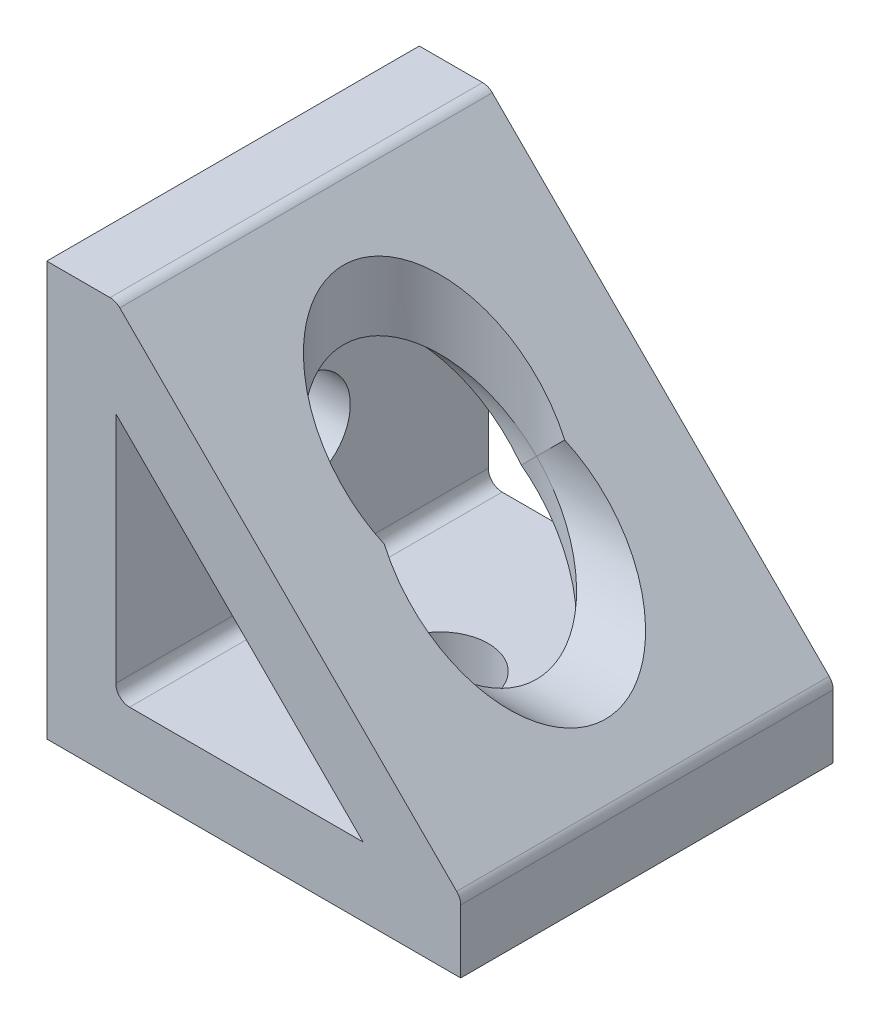
ISO-10303-21;
HEADER;
FILE_DESCRIPTION(('STEP AP214'),'2;1');
FILE_NAME('part.step','',(''),(''),'','','');
FILE_SCHEMA(('AUTOMOTIVE_DESIGN { 1 0 10303 214 1 1 1 1 }'));
ENDSEC;
DATA;
#1=APPLICATION_CONTEXT('core data for automotive mechanical design processes');
#2=APPLICATION_PROTOCOL_DEFINITION('international standard','automotive_design',2000,#1);
#3=PRODUCT_CONTEXT('',#1,'mechanical');
#4=PRODUCT('Part','Part','',(#3));
#5=PRODUCT_RELATED_PRODUCT_CATEGORY('part','',(#4));
#6=PRODUCT_DEFINITION_FORMATION('','',#4);
#7=PRODUCT_DEFINITION_CONTEXT('part definition',#1,'design');
#8=PRODUCT_DEFINITION('design','',#6,#7);
#9=PRODUCT_DEFINITION_SHAPE('','',#8);
#10=(LENGTH_UNIT() NAMED_UNIT(*) SI_UNIT(.MILLI.,.METRE.));
#11=(NAMED_UNIT(*) PLANE_ANGLE_UNIT() SI_UNIT($,.RADIAN.));
#12=(NAMED_UNIT(*) SI_UNIT($,.STERADIAN.) SOLID_ANGLE_UNIT());
#13=UNCERTAINTY_MEASURE_WITH_UNIT(LENGTH_MEASURE(1.E-05),#10,'distance_accuracy_value','');
#14=(GEOMETRIC_REPRESENTATION_CONTEXT(3) GLOBAL_UNCERTAINTY_ASSIGNED_CONTEXT((#13)) GLOBAL_UNIT_ASSIGNED_CONTEXT((#10,
#11,#12)) REPRESENTATION_CONTEXT('',''));
#15=CARTESIAN_POINT('',(0.,0.,0.));
#16=DIRECTION('',(0.,0.,1.));
#17=DIRECTION('',(1.,0.,0.));
#18=AXIS2_PLACEMENT_3D('',#15,#16,#17);
#19=CARTESIAN_POINT('',(6.00000000000002,6.00000000000003,-13.5));
#20=DIRECTION('',(0.,0.,-1.));
#21=DIRECTION('',(-1.,0.,0.));
#22=AXIS2_PLACEMENT_3D('',#19,#20,#21);
#23=CYLINDRICAL_SURFACE('',#22,1.);
#24=DIRECTION('',(0.,0.,1.));
#25=VECTOR('',#24,1.);
#26=CARTESIAN_POINT('',(5.00000000000002,6.00000000000003,-13.5));
#27=LINE('',#26,#25);
#28=CARTESIAN_POINT('',(5.00000000000002,6.00000000000003,-13.5));
#29=VERTEX_POINT('',#28);
#30=CARTESIAN_POINT('',(5.00000000000002,5.99999999999993,13.5));
#31=VERTEX_POINT('',#30);
#32=EDGE_CURVE('E127',#29,#31,#27,.T.);
#33=ORIENTED_EDGE('',*,*,#32,.T.);
#34=CARTESIAN_POINT('',(6.00000000000002,5.99999999999993,13.5));
#35=DIRECTION('',(0.,0.,-1.));
#36=DIRECTION('',(-1.,0.,0.));
#37=AXIS2_PLACEMENT_3D('',#34,#35,#36);
#38=CIRCLE('',#37,1.);
#39=CARTESIAN_POINT('',(6.00000000000002,4.99999999999993,13.5));
#40=VERTEX_POINT('',#39);
#41=EDGE_CURVE('E18',#40,#31,#38,.T.);
#42=ORIENTED_EDGE('',*,*,#41,.F.);
#43=DIRECTION('',(0.,0.,1.));
#44=VECTOR('',#43,1.);
#45=CARTESIAN_POINT('',(6.00000000000002,5.00000000000003,-13.5));
#46=LINE('',#45,#44);
#47=CARTESIAN_POINT('',(6.00000000000002,5.00000000000003,-13.5));
#48=VERTEX_POINT('',#47);
#49=EDGE_CURVE('E130',#40,#48,#46,.F.);
#50=ORIENTED_EDGE('',*,*,#49,.T.);
#51=CARTESIAN_POINT('',(6.00000000000002,6.00000000000003,-13.5));
#52=DIRECTION('',(0.,0.,-1.));
#53=DIRECTION('',(-1.,0.,0.));
#54=AXIS2_PLACEMENT_3D('',#51,#52,#53);
#55=CIRCLE('',#54,1.);
#56=EDGE_CURVE('E125',#29,#48,#55,.F.);
#57=ORIENTED_EDGE('',*,*,#56,.F.);
#58=EDGE_LOOP('',(#33,#42,#50,#57));
#59=FACE_BOUND('',#58,.T.);
#60=ADVANCED_FACE('F15',(#59),#23,.F.);
#61=CARTESIAN_POINT('',(30.0000000000001,14.9999999999999,0.));
#62=DIRECTION('',(-1.,0.,0.));
#63=DIRECTION('',(0.,-1.,0.));
#64=AXIS2_PLACEMENT_3D('',#61,#62,#63);
#65=CYLINDRICAL_SURFACE('',#64,7.);
#66=CARTESIAN_POINT('',(15.0000000000001,14.9999999999999,0.));
#67=DIRECTION('',(-0.70710678118655,-0.707106781186545,0.));
#68=DIRECTION('',(-0.707106781186545,0.70710678118655,0.));
#69=AXIS2_PLACEMENT_3D('',#66,#67,#68);
#70=ELLIPSE('',#69,9.89949493661167,7.);
#71=CARTESIAN_POINT('',(15.0000000000001,15.,-6.99999999999994));
#72=VERTEX_POINT('',#71);
#73=CARTESIAN_POINT('',(15.0000000000001,14.9999999999999,7.00000000000006));
#74=VERTEX_POINT('',#73);
#75=EDGE_CURVE('E223',#72,#74,#70,.F.);
#76=ORIENTED_EDGE('',*,*,#75,.T.);
#77=CARTESIAN_POINT('',(15.0000000000001,14.9999999999999,0.));
#78=DIRECTION('',(0.707106781186545,-0.70710678118655,0.));
#79=DIRECTION('',(-0.70710678118655,-0.707106781186545,0.));
#80=AXIS2_PLACEMENT_3D('',#77,#78,#79);
#81=ELLIPSE('',#80,9.89949493661166,7.);
#82=CARTESIAN_POINT('',(13.9644660940673,13.9644660940672,6.92298126024218));
#83=VERTEX_POINT('',#82);
#84=EDGE_CURVE('E231',#83,#74,#81,.F.);
#85=ORIENTED_EDGE('',*,*,#84,.F.);
#86=CARTESIAN_POINT('',(12.9289321881346,14.9999999999999,0.));
#87=DIRECTION('',(0.70710678118655,0.707106781186545,0.));
#88=DIRECTION('',(-0.707106781186545,0.70710678118655,0.));
#89=AXIS2_PLACEMENT_3D('',#86,#87,#88);
#90=ELLIPSE('',#89,9.89949493661167,7.);
#91=CARTESIAN_POINT('',(13.9644660940673,13.9644660940672,-6.92298126024207));
#92=VERTEX_POINT('',#91);
#93=EDGE_CURVE('E209',#83,#92,#90,.F.);
#94=ORIENTED_EDGE('',*,*,#93,.T.);
#95=CARTESIAN_POINT('',(15.0000000000001,14.9999999999999,0.));
#96=DIRECTION('',(-0.707106781186545,0.70710678118655,0.));
#97=DIRECTION('',(-0.70710678118655,-0.707106781186545,0.));
#98=AXIS2_PLACEMENT_3D('',#95,#96,#97);
#99=ELLIPSE('',#98,9.89949493661166,7.);
#100=EDGE_CURVE('E228',#92,#72,#99,.F.);
#101=ORIENTED_EDGE('',*,*,#100,.T.);
#102=EDGE_LOOP('',(#76,#85,#94,#101));
#103=FACE_BOUND('',#102,.T.);
#104=ADVANCED_FACE('F426',(#103),#65,.F.);
#105=CARTESIAN_POINT('',(15.0000000000001,29.9999999999999,1.13867248963117E-13));
#106=DIRECTION('',(0.,-1.,0.));
#107=DIRECTION('',(1.,0.,0.));
#108=AXIS2_PLACEMENT_3D('',#105,#106,#107);
#109=CYLINDRICAL_SURFACE('',#108,7.);
#110=CARTESIAN_POINT('',(15.0000000000001,14.9999999999999,0.));
#111=DIRECTION('',(-0.70710678118655,-0.707106781186545,0.));
#112=DIRECTION('',(0.707106781186545,-0.70710678118655,0.));
#113=AXIS2_PLACEMENT_3D('',#110,#111,#112);
#114=ELLIPSE('',#113,9.89949493661167,7.);
#115=EDGE_CURVE('E226',#74,#72,#114,.F.);
#116=ORIENTED_EDGE('',*,*,#115,.T.);
#117=ORIENTED_EDGE('',*,*,#100,.F.);
#118=CARTESIAN_POINT('',(15.,12.9289321881345,0.));
#119=DIRECTION('',(0.70710678118655,0.707106781186545,0.));
#120=DIRECTION('',(0.707106781186545,-0.70710678118655,0.));
#121=AXIS2_PLACEMENT_3D('',#118,#119,#120);
#122=ELLIPSE('',#121,9.89949493661167,7.);
#123=EDGE_CURVE('E187',#92,#83,#122,.F.);
#124=ORIENTED_EDGE('',*,*,#123,.T.);
#125=ORIENTED_EDGE('',*,*,#84,.T.);
#126=EDGE_LOOP('',(#116,#117,#124,#125));
#127=FACE_BOUND('',#126,.T.);
#128=ADVANCED_FACE('F417',(#127),#109,.F.);
#129=CARTESIAN_POINT('',(30.0000000000001,14.9999999999999,0.));
#130=DIRECTION('',(-1.,0.,0.));
#131=DIRECTION('',(0.,-1.,0.));
#132=AXIS2_PLACEMENT_3D('',#129,#130,#131);
#133=CYLINDRICAL_SURFACE('',#132,7.);
#134=CARTESIAN_POINT('',(20.0000000000001,14.9999999999999,0.));
#135=DIRECTION('',(0.70710678118655,0.707106781186545,0.));
#136=DIRECTION('',(-0.707106781186545,0.70710678118655,0.));
#137=AXIS2_PLACEMENT_3D('',#134,#135,#136);
#138=ELLIPSE('',#137,9.89949493661167,7.);
#139=CARTESIAN_POINT('',(17.5000000000001,17.5,-6.53834841531094));
#140=VERTEX_POINT('',#139);
#141=CARTESIAN_POINT('',(17.5000000000001,17.4999999999999,6.53834841531107));
#142=VERTEX_POINT('',#141);
#143=EDGE_CURVE('E184',#140,#142,#138,.F.);
#144=ORIENTED_EDGE('',*,*,#143,.F.);
#145=CARTESIAN_POINT('',(15.0000000000001,14.9999999999999,0.));
#146=DIRECTION('',(-0.707106781186545,0.70710678118655,0.));
#147=DIRECTION('',(-0.70710678118655,-0.707106781186545,0.));
#148=AXIS2_PLACEMENT_3D('',#145,#146,#147);
#149=ELLIPSE('',#148,9.89949493661166,7.);
#150=EDGE_CURVE('E218',#140,#72,#149,.T.);
#151=ORIENTED_EDGE('',*,*,#150,.T.);
#152=ORIENTED_EDGE('',*,*,#115,.F.);
#153=CARTESIAN_POINT('',(15.0000000000001,14.9999999999999,0.));
#154=DIRECTION('',(-0.707106781186545,0.70710678118655,0.));
#155=DIRECTION('',(-0.70710678118655,-0.707106781186545,0.));
#156=AXIS2_PLACEMENT_3D('',#153,#154,#155);
#157=ELLIPSE('',#156,9.89949493661166,7.);
#158=EDGE_CURVE('E221',#74,#142,#157,.T.);
#159=ORIENTED_EDGE('',*,*,#158,.T.);
#160=EDGE_LOOP('',(#144,#151,#152,#159));
#161=FACE_BOUND('',#160,.T.);
#162=ADVANCED_FACE('F408',(#161),#133,.F.);
#163=CARTESIAN_POINT('',(15.0000000000001,29.9999999999999,1.13867248963117E-13));
#164=DIRECTION('',(0.,-1.,0.));
#165=DIRECTION('',(1.,0.,0.));
#166=AXIS2_PLACEMENT_3D('',#163,#164,#165);
#167=CYLINDRICAL_SURFACE('',#166,7.);
#168=CARTESIAN_POINT('',(15.0000000000001,19.9999999999999,0.));
#169=DIRECTION('',(0.70710678118655,0.707106781186545,0.));
#170=DIRECTION('',(0.707106781186545,-0.70710678118655,0.));
#171=AXIS2_PLACEMENT_3D('',#168,#169,#170);
#172=ELLIPSE('',#171,9.89949493661167,7.);
#173=EDGE_CURVE('E175',#142,#140,#172,.F.);
#174=ORIENTED_EDGE('',*,*,#173,.F.);
#175=ORIENTED_EDGE('',*,*,#158,.F.);
#176=ORIENTED_EDGE('',*,*,#75,.F.);
#177=ORIENTED_EDGE('',*,*,#150,.F.);
#178=EDGE_LOOP('',(#174,#175,#176,#177));
#179=FACE_BOUND('',#178,.T.);
#180=ADVANCED_FACE('F400',(#179),#167,.F.);
#181=CARTESIAN_POINT('',(29.,4.58578643762685,-13.5));
#182=DIRECTION('',(0.,0.,1.));
#183=DIRECTION('',(1.,0.,0.));
#184=AXIS2_PLACEMENT_3D('',#181,#182,#183);
#185=CYLINDRICAL_SURFACE('',#184,1.);
#186=CARTESIAN_POINT('',(29.,4.58578643762674,13.5));
#187=DIRECTION('',(0.,0.,1.));
#188=DIRECTION('',(1.,0.,0.));
#189=AXIS2_PLACEMENT_3D('',#186,#187,#188);
#190=CIRCLE('',#189,1.);
#191=CARTESIAN_POINT('',(29.7071067811866,5.29289321881329,13.5));
#192=VERTEX_POINT('',#191);
#193=CARTESIAN_POINT('',(30.,4.58578643762674,13.5));
#194=VERTEX_POINT('',#193);
#195=EDGE_CURVE('E214',#192,#194,#190,.F.);
#196=ORIENTED_EDGE('',*,*,#195,.T.);
#197=DIRECTION('',(0.,0.,-1.));
#198=VECTOR('',#197,1.);
#199=CARTESIAN_POINT('',(30.,4.58578643762684,-13.5));
#200=LINE('',#199,#198);
#201=CARTESIAN_POINT('',(30.,4.58578643762684,-13.5));
#202=VERTEX_POINT('',#201);
#203=EDGE_CURVE('E157',#202,#194,#200,.F.);
#204=ORIENTED_EDGE('',*,*,#203,.F.);
#205=CARTESIAN_POINT('',(29.,4.58578643762685,-13.5));
#206=DIRECTION('',(0.,0.,1.));
#207=DIRECTION('',(1.,0.,0.));
#208=AXIS2_PLACEMENT_3D('',#205,#206,#207);
#209=CIRCLE('',#208,1.);
#210=CARTESIAN_POINT('',(29.7071067811866,5.29289321881339,-13.5));
#211=VERTEX_POINT('',#210);
#212=EDGE_CURVE('E216',#202,#211,#209,.T.);
#213=ORIENTED_EDGE('',*,*,#212,.T.);
#214=DIRECTION('',(0.,0.,1.));
#215=VECTOR('',#214,1.);
#216=CARTESIAN_POINT('',(29.7071067811866,5.29289321881339,-13.5));
#217=LINE('',#216,#215);
#218=EDGE_CURVE('E172',#192,#211,#217,.F.);
#219=ORIENTED_EDGE('',*,*,#218,.F.);
#220=EDGE_LOOP('',(#196,#204,#213,#219));
#221=FACE_BOUND('',#220,.T.);
#222=ADVANCED_FACE('F266',(#221),#185,.T.);
#223=CARTESIAN_POINT('',(15.0000000000001,14.9999999999999,0.));
#224=DIRECTION('',(0.,-1.,0.));
#225=DIRECTION('',(1.,0.,0.));
#226=AXIS2_PLACEMENT_3D('',#223,#224,#225);
#227=CYLINDRICAL_SURFACE('',#226,3.5);
#228=CARTESIAN_POINT('',(15.,0.,0.));
#229=DIRECTION('',(0.,-1.,0.));
#230=DIRECTION('',(1.,0.,0.));
#231=AXIS2_PLACEMENT_3D('',#228,#229,#230);
#232=CIRCLE('',#231,3.5);
#233=CARTESIAN_POINT('',(18.5,0.,0.));
#234=VERTEX_POINT('',#233);
#235=EDGE_CURVE('E169',#234,#234,#232,.F.);
#236=ORIENTED_EDGE('',*,*,#235,.F.);
#237=EDGE_LOOP('',(#236));
#238=FACE_BOUND('',#237,.T.);
#239=CARTESIAN_POINT('',(15.,4.99999999999995,0.));
#240=DIRECTION('',(0.,-1.,0.));
#241=DIRECTION('',(1.,0.,0.));
#242=AXIS2_PLACEMENT_3D('',#239,#240,#241);
#243=CIRCLE('',#242,3.5);
#244=CARTESIAN_POINT('',(18.5,4.99999999999993,0.));
#245=VERTEX_POINT('',#244);
#246=EDGE_CURVE('E177',#245,#245,#243,.F.);
#247=ORIENTED_EDGE('',*,*,#246,.T.);
#248=EDGE_LOOP('',(#247));
#249=FACE_BOUND('',#248,.T.);
#250=ADVANCED_FACE('F279',(#238,#249),#227,.F.);
#251=CARTESIAN_POINT('',(4.58578643762702,29.,-13.4999999999999));
#252=DIRECTION('',(0.,0.,1.));
#253=DIRECTION('',(1.,0.,0.));
#254=AXIS2_PLACEMENT_3D('',#251,#252,#253);
#255=CYLINDRICAL_SURFACE('',#254,1.);
#256=CARTESIAN_POINT('',(4.58578643762702,28.9999999999999,13.5000000000001));
#257=DIRECTION('',(0.,0.,1.));
#258=DIRECTION('',(1.,0.,0.));
#259=AXIS2_PLACEMENT_3D('',#256,#257,#258);
#260=CIRCLE('',#259,1.);
#261=CARTESIAN_POINT('',(4.58578643762702,29.9999999999999,13.5000000000001));
#262=VERTEX_POINT('',#261);
#263=CARTESIAN_POINT('',(5.29289321881357,29.7071067811865,13.5000000000001));
#264=VERTEX_POINT('',#263);
#265=EDGE_CURVE('E150',#262,#264,#260,.F.);
#266=ORIENTED_EDGE('',*,*,#265,.T.);
#267=DIRECTION('',(0.,0.,1.));
#268=VECTOR('',#267,1.);
#269=CARTESIAN_POINT('',(5.29289321881357,29.7071067811866,-13.4999999999999));
#270=LINE('',#269,#268);
#271=CARTESIAN_POINT('',(5.29289321881357,29.7071067811866,-13.4999999999999));
#272=VERTEX_POINT('',#271);
#273=EDGE_CURVE('E161',#272,#264,#270,.T.);
#274=ORIENTED_EDGE('',*,*,#273,.F.);
#275=CARTESIAN_POINT('',(4.58578643762702,29.,-13.4999999999999));
#276=DIRECTION('',(0.,0.,1.));
#277=DIRECTION('',(1.,0.,0.));
#278=AXIS2_PLACEMENT_3D('',#275,#276,#277);
#279=CIRCLE('',#278,1.);
#280=CARTESIAN_POINT('',(4.58578643762702,30.,-13.4999999999999));
#281=VERTEX_POINT('',#280);
#282=EDGE_CURVE('E131',#272,#281,#279,.T.);
#283=ORIENTED_EDGE('',*,*,#282,.T.);
#284=DIRECTION('',(0.,0.,1.));
#285=VECTOR('',#284,1.);
#286=CARTESIAN_POINT('',(4.58578643762702,30.,-13.4999999999999));
#287=LINE('',#286,#285);
#288=EDGE_CURVE('E151',#262,#281,#287,.F.);
#289=ORIENTED_EDGE('',*,*,#288,.F.);
#290=EDGE_LOOP('',(#266,#274,#283,#289));
#291=FACE_BOUND('',#290,.T.);
#292=ADVANCED_FACE('F257',(#291),#255,.T.);
#293=CARTESIAN_POINT('',(5.00000000000002,5.00000000000003,-13.5));
#294=DIRECTION('',(-1.,0.,0.));
#295=DIRECTION('',(0.,-1.,0.));
#296=AXIS2_PLACEMENT_3D('',#293,#294,#295);
#297=PLANE('',#296);
#298=CARTESIAN_POINT('',(5.00000000000006,15.,0.));
#299=DIRECTION('',(-1.,0.,0.));
#300=DIRECTION('',(0.,0.,1.));
#301=AXIS2_PLACEMENT_3D('',#298,#299,#300);
#302=CIRCLE('',#301,3.5);
#303=CARTESIAN_POINT('',(5.00000000000006,15.,3.50000000000006));
#304=VERTEX_POINT('',#303);
#305=EDGE_CURVE('E160',#304,#304,#302,.T.);
#306=ORIENTED_EDGE('',*,*,#305,.T.);
#307=EDGE_LOOP('',(#306));
#308=FACE_BOUND('',#307,.T.);
#309=ORIENTED_EDGE('',*,*,#32,.F.);
#310=DIRECTION('',(0.,1.,0.));
#311=VECTOR('',#310,1.);
#312=CARTESIAN_POINT('',(5.,0.,-13.5));
#313=LINE('',#312,#311);
#314=CARTESIAN_POINT('',(5.0000000000001,22.9289321881345,-13.4999999999999));
#315=VERTEX_POINT('',#314);
#316=EDGE_CURVE('E152',#315,#29,#313,.F.);
#317=ORIENTED_EDGE('',*,*,#316,.F.);
#318=DIRECTION('',(0.,0.,1.));
#319=VECTOR('',#318,1.);
#320=CARTESIAN_POINT('',(5.00000000000009,22.9289321881345,-13.4999999999999));
#321=LINE('',#320,#319);
#322=CARTESIAN_POINT('',(5.00000000000009,22.9289321881344,13.5000000000001));
#323=VERTEX_POINT('',#322);
#324=EDGE_CURVE('E135',#315,#323,#321,.T.);
#325=ORIENTED_EDGE('',*,*,#324,.T.);
#326=DIRECTION('',(0.,1.,0.));
#327=VECTOR('',#326,1.);
#328=CARTESIAN_POINT('',(5.,0.,13.5));
#329=LINE('',#328,#327);
#330=EDGE_CURVE('E122',#323,#31,#329,.F.);
#331=ORIENTED_EDGE('',*,*,#330,.T.);
#332=EDGE_LOOP('',(#309,#317,#325,#331));
#333=FACE_BOUND('',#332,.T.);
#334=ADVANCED_FACE('F133',(#308,#333),#297,.F.);
#335=CARTESIAN_POINT('',(5.00000000000002,5.00000000000003,-13.5));
#336=DIRECTION('',(0.,-1.,0.));
#337=DIRECTION('',(1.,0.,0.));
#338=AXIS2_PLACEMENT_3D('',#335,#336,#337);
#339=PLANE('',#338);
#340=ORIENTED_EDGE('',*,*,#246,.F.);
#341=EDGE_LOOP('',(#340));
#342=FACE_BOUND('',#341,.T.);
#343=ORIENTED_EDGE('',*,*,#49,.F.);
#344=DIRECTION('',(-1.,0.,0.));
#345=VECTOR('',#344,1.);
#346=CARTESIAN_POINT('',(0.,4.99999999999995,13.5));
#347=LINE('',#346,#345);
#348=CARTESIAN_POINT('',(22.9289321881345,4.99999999999986,13.5));
#349=VERTEX_POINT('',#348);
#350=EDGE_CURVE('E124',#40,#349,#347,.F.);
#351=ORIENTED_EDGE('',*,*,#350,.T.);
#352=DIRECTION('',(0.,0.,1.));
#353=VECTOR('',#352,1.);
#354=CARTESIAN_POINT('',(22.9289321881345,4.99999999999997,-13.5));
#355=LINE('',#354,#353);
#356=CARTESIAN_POINT('',(22.9289321881345,4.99999999999996,-13.5));
#357=VERTEX_POINT('',#356);
#358=EDGE_CURVE('E183',#349,#357,#355,.F.);
#359=ORIENTED_EDGE('',*,*,#358,.T.);
#360=DIRECTION('',(-1.,0.,0.));
#361=VECTOR('',#360,1.);
#362=CARTESIAN_POINT('',(0.,5.00000000000005,-13.5));
#363=LINE('',#362,#361);
#364=EDGE_CURVE('E182',#48,#357,#363,.F.);
#365=ORIENTED_EDGE('',*,*,#364,.F.);
#366=EDGE_LOOP('',(#343,#351,#359,#365));
#367=FACE_BOUND('',#366,.T.);
#368=ADVANCED_FACE('F237',(#342,#367),#339,.F.);
#369=CARTESIAN_POINT('',(22.9289321881345,4.99999999999997,-13.5));
#370=DIRECTION('',(0.70710678118655,0.707106781186545,0.));
#371=DIRECTION('',(-0.707106781186545,0.70710678118655,0.));
#372=AXIS2_PLACEMENT_3D('',#369,#370,#371);
#373=PLANE('',#372);
#374=DIRECTION('',(-0.707106781186545,0.70710678118655,0.));
#375=VECTOR('',#374,1.);
#376=CARTESIAN_POINT('',(22.9289321881345,4.99999999999986,13.5));
#377=LINE('',#376,#375);
#378=EDGE_CURVE('E137',#349,#323,#377,.T.);
#379=ORIENTED_EDGE('',*,*,#378,.T.);
#380=ORIENTED_EDGE('',*,*,#324,.F.);
#381=DIRECTION('',(-0.707106781186545,0.70710678118655,0.));
#382=VECTOR('',#381,1.);
#383=CARTESIAN_POINT('',(22.9289321881345,4.99999999999997,-13.5));
#384=LINE('',#383,#382);
#385=EDGE_CURVE('E178',#357,#315,#384,.T.);
#386=ORIENTED_EDGE('',*,*,#385,.F.);
#387=ORIENTED_EDGE('',*,*,#358,.F.);
#388=EDGE_LOOP('',(#379,#380,#386,#387));
#389=FACE_BOUND('',#388,.T.);
#390=ORIENTED_EDGE('',*,*,#93,.F.);
#391=ORIENTED_EDGE('',*,*,#123,.F.);
#392=EDGE_LOOP('',(#390,#391));
#393=FACE_BOUND('',#392,.T.);
#394=ADVANCED_FACE('F286',(#389,#393),#373,.F.);
#395=CARTESIAN_POINT('',(30.,4.99999999999994,-13.5));
#396=DIRECTION('',(0.70710678118655,0.707106781186545,0.));
#397=DIRECTION('',(-0.707106781186545,0.70710678118655,0.));
#398=AXIS2_PLACEMENT_3D('',#395,#396,#397);
#399=PLANE('',#398);
#400=DIRECTION('',(0.707106781186545,-0.70710678118655,0.));
#401=VECTOR('',#400,1.);
#402=CARTESIAN_POINT('',(5.29289321881357,29.7071067811866,-13.4999999999999));
#403=LINE('',#402,#401);
#404=EDGE_CURVE('E181',#272,#211,#403,.T.);
#405=ORIENTED_EDGE('',*,*,#404,.F.);
#406=ORIENTED_EDGE('',*,*,#273,.T.);
#407=DIRECTION('',(0.707106781186545,-0.70710678118655,0.));
#408=VECTOR('',#407,1.);
#409=CARTESIAN_POINT('',(5.29289321881357,29.7071067811865,13.5000000000001));
#410=LINE('',#409,#408);
#411=EDGE_CURVE('E147',#264,#192,#410,.T.);
#412=ORIENTED_EDGE('',*,*,#411,.T.);
#413=ORIENTED_EDGE('',*,*,#218,.T.);
#414=EDGE_LOOP('',(#405,#406,#412,#413));
#415=FACE_BOUND('',#414,.T.);
#416=ORIENTED_EDGE('',*,*,#143,.T.);
#417=ORIENTED_EDGE('',*,*,#173,.T.);
#418=EDGE_LOOP('',(#416,#417));
#419=FACE_BOUND('',#418,.T.);
#420=ADVANCED_FACE('F260',(#415,#419),#399,.T.);
#421=CARTESIAN_POINT('',(30.,4.99999999999994,-13.5));
#422=DIRECTION('',(1.,0.,0.));
#423=DIRECTION('',(0.,0.,-1.));
#424=AXIS2_PLACEMENT_3D('',#421,#422,#423);
#425=PLANE('',#424);
#426=DIRECTION('',(0.,1.,0.));
#427=VECTOR('',#426,1.);
#428=CARTESIAN_POINT('',(30.,-1.65107510996521E-13,13.5));
#429=LINE('',#428,#427);
#430=CARTESIAN_POINT('',(30.,-1.65107510996521E-13,13.5));
#431=VERTEX_POINT('',#430);
#432=EDGE_CURVE('E141',#194,#431,#429,.F.);
#433=ORIENTED_EDGE('',*,*,#432,.T.);
#434=DIRECTION('',(0.,0.,1.));
#435=VECTOR('',#434,1.);
#436=CARTESIAN_POINT('',(30.,0.,-13.5));
#437=LINE('',#436,#435);
#438=CARTESIAN_POINT('',(30.,0.,-13.5));
#439=VERTEX_POINT('',#438);
#440=EDGE_CURVE('E166',#439,#431,#437,.T.);
#441=ORIENTED_EDGE('',*,*,#440,.F.);
#442=DIRECTION('',(0.,1.,0.));
#443=VECTOR('',#442,1.);
#444=CARTESIAN_POINT('',(30.,0.,-13.5));
#445=LINE('',#444,#443);
#446=EDGE_CURVE('E165',#202,#439,#445,.F.);
#447=ORIENTED_EDGE('',*,*,#446,.F.);
#448=ORIENTED_EDGE('',*,*,#203,.T.);
#449=EDGE_LOOP('',(#433,#441,#447,#448));
#450=FACE_BOUND('',#449,.T.);
#451=ADVANCED_FACE('F269',(#450),#425,.T.);
#452=CARTESIAN_POINT('',(15.0000000000001,14.9999999999999,0.));
#453=DIRECTION('',(-1.,0.,0.));
#454=DIRECTION('',(0.,0.,1.));
#455=AXIS2_PLACEMENT_3D('',#452,#453,#454);
#456=CYLINDRICAL_SURFACE('',#455,3.5);
#457=CARTESIAN_POINT('',(0.,15.,0.));
#458=DIRECTION('',(-1.,0.,0.));
#459=DIRECTION('',(0.,0.,1.));
#460=AXIS2_PLACEMENT_3D('',#457,#458,#459);
#461=CIRCLE('',#460,3.5);
#462=CARTESIAN_POINT('',(0.,15.,3.50000000000006));
#463=VERTEX_POINT('',#462);
#464=EDGE_CURVE('E196',#463,#463,#461,.F.);
#465=ORIENTED_EDGE('',*,*,#464,.F.);
#466=EDGE_LOOP('',(#465));
#467=FACE_BOUND('',#466,.T.);
#468=ORIENTED_EDGE('',*,*,#305,.F.);
#469=EDGE_LOOP('',(#468));
#470=FACE_BOUND('',#469,.T.);
#471=ADVANCED_FACE('F275',(#467,#470),#456,.F.);
#472=CARTESIAN_POINT('',(0.,0.,-13.5));
#473=DIRECTION('',(0.,-1.,0.));
#474=DIRECTION('',(1.,0.,0.));
#475=AXIS2_PLACEMENT_3D('',#472,#473,#474);
#476=PLANE('',#475);
#477=DIRECTION('',(0.,0.,1.));
#478=VECTOR('',#477,1.);
#479=CARTESIAN_POINT('',(0.,0.,-13.5));
#480=LINE('',#479,#478);
#481=CARTESIAN_POINT('',(0.,0.,-13.5));
#482=VERTEX_POINT('',#481);
#483=CARTESIAN_POINT('',(0.,0.,13.5));
#484=VERTEX_POINT('',#483);
#485=EDGE_CURVE('E191',#482,#484,#480,.T.);
#486=ORIENTED_EDGE('',*,*,#485,.F.);
#487=DIRECTION('',(-1.,0.,0.));
#488=VECTOR('',#487,1.);
#489=CARTESIAN_POINT('',(0.,0.,-13.5));
#490=LINE('',#489,#488);
#491=EDGE_CURVE('E162',#439,#482,#490,.T.);
#492=ORIENTED_EDGE('',*,*,#491,.F.);
#493=ORIENTED_EDGE('',*,*,#440,.T.);
#494=DIRECTION('',(-1.,0.,0.));
#495=VECTOR('',#494,1.);
#496=CARTESIAN_POINT('',(0.,0.,13.5));
#497=LINE('',#496,#495);
#498=EDGE_CURVE('E168',#431,#484,#497,.T.);
#499=ORIENTED_EDGE('',*,*,#498,.T.);
#500=EDGE_LOOP('',(#486,#492,#493,#499));
#501=FACE_BOUND('',#500,.T.);
#502=ORIENTED_EDGE('',*,*,#235,.T.);
#503=EDGE_LOOP('',(#502));
#504=FACE_BOUND('',#503,.T.);
#505=ADVANCED_FACE('F272',(#501,#504),#476,.T.);
#506=CARTESIAN_POINT('',(0.,0.,13.5));
#507=DIRECTION('',(0.,0.,-1.));
#508=DIRECTION('',(-1.,0.,0.));
#509=AXIS2_PLACEMENT_3D('',#506,#507,#508);
#510=PLANE('',#509);
#511=ORIENTED_EDGE('',*,*,#41,.T.);
#512=ORIENTED_EDGE('',*,*,#330,.F.);
#513=ORIENTED_EDGE('',*,*,#378,.F.);
#514=ORIENTED_EDGE('',*,*,#350,.F.);
#515=EDGE_LOOP('',(#511,#512,#513,#514));
#516=FACE_BOUND('',#515,.T.);
#517=ORIENTED_EDGE('',*,*,#195,.F.);
#518=ORIENTED_EDGE('',*,*,#411,.F.);
#519=ORIENTED_EDGE('',*,*,#265,.F.);
#520=DIRECTION('',(-1.,0.,0.));
#521=VECTOR('',#520,1.);
#522=CARTESIAN_POINT('',(0.,29.9999999999999,13.5000000000001));
#523=LINE('',#522,#521);
#524=CARTESIAN_POINT('',(0.,29.9999999999999,13.5000000000001));
#525=VERTEX_POINT('',#524);
#526=EDGE_CURVE('E139',#525,#262,#523,.F.);
#527=ORIENTED_EDGE('',*,*,#526,.F.);
#528=DIRECTION('',(0.,-1.,0.));
#529=VECTOR('',#528,1.);
#530=CARTESIAN_POINT('',(0.,0.,13.5));
#531=LINE('',#530,#529);
#532=EDGE_CURVE('E156',#484,#525,#531,.F.);
#533=ORIENTED_EDGE('',*,*,#532,.F.);
#534=ORIENTED_EDGE('',*,*,#498,.F.);
#535=ORIENTED_EDGE('',*,*,#432,.F.);
#536=EDGE_LOOP('',(#517,#518,#519,#527,#533,#534,#535));
#537=FACE_BOUND('',#536,.T.);
#538=ADVANCED_FACE('F118',(#516,#537),#510,.F.);
#539=CARTESIAN_POINT('',(0.,30.,-13.4999999999999));
#540=DIRECTION('',(0.,1.,0.));
#541=DIRECTION('',(-1.,0.,0.));
#542=AXIS2_PLACEMENT_3D('',#539,#540,#541);
#543=PLANE('',#542);
#544=DIRECTION('',(-1.,0.,0.));
#545=VECTOR('',#544,1.);
#546=CARTESIAN_POINT('',(1.13867248963118E-13,30.,-13.4999999999999));
#547=LINE('',#546,#545);
#548=CARTESIAN_POINT('',(1.13867248963118E-13,30.,-13.4999999999999));
#549=VERTEX_POINT('',#548);
#550=EDGE_CURVE('E33',#549,#281,#547,.F.);
#551=ORIENTED_EDGE('',*,*,#550,.F.);
#552=DIRECTION('',(0.,0.,1.));
#553=VECTOR('',#552,1.);
#554=CARTESIAN_POINT('',(0.,30.,-13.4999999999999));
#555=LINE('',#554,#553);
#556=EDGE_CURVE('E24',#525,#549,#555,.F.);
#557=ORIENTED_EDGE('',*,*,#556,.F.);
#558=ORIENTED_EDGE('',*,*,#526,.T.);
#559=ORIENTED_EDGE('',*,*,#288,.T.);
#560=EDGE_LOOP('',(#551,#557,#558,#559));
#561=FACE_BOUND('',#560,.T.);
#562=ADVANCED_FACE('F252',(#561),#543,.T.);
#563=CARTESIAN_POINT('',(0.,0.,-13.5));
#564=DIRECTION('',(0.,0.,-1.));
#565=DIRECTION('',(-1.,0.,0.));
#566=AXIS2_PLACEMENT_3D('',#563,#564,#565);
#567=PLANE('',#566);
#568=ORIENTED_EDGE('',*,*,#550,.T.);
#569=ORIENTED_EDGE('',*,*,#282,.F.);
#570=ORIENTED_EDGE('',*,*,#404,.T.);
#571=ORIENTED_EDGE('',*,*,#212,.F.);
#572=ORIENTED_EDGE('',*,*,#446,.T.);
#573=ORIENTED_EDGE('',*,*,#491,.T.);
#574=DIRECTION('',(0.,-1.,0.));
#575=VECTOR('',#574,1.);
#576=CARTESIAN_POINT('',(0.,0.,-13.5));
#577=LINE('',#576,#575);
#578=EDGE_CURVE('E9',#549,#482,#577,.T.);
#579=ORIENTED_EDGE('',*,*,#578,.F.);
#580=EDGE_LOOP('',(#568,#569,#570,#571,#572,#573,#579));
#581=FACE_BOUND('',#580,.T.);
#582=ORIENTED_EDGE('',*,*,#364,.T.);
#583=ORIENTED_EDGE('',*,*,#385,.T.);
#584=ORIENTED_EDGE('',*,*,#316,.T.);
#585=ORIENTED_EDGE('',*,*,#56,.T.);
#586=EDGE_LOOP('',(#582,#583,#584,#585));
#587=FACE_BOUND('',#586,.T.);
#588=ADVANCED_FACE('F234',(#581,#587),#567,.T.);
#589=CARTESIAN_POINT('',(0.,0.,-13.5));
#590=DIRECTION('',(-1.,0.,0.));
#591=DIRECTION('',(0.,-1.,0.));
#592=AXIS2_PLACEMENT_3D('',#589,#590,#591);
#593=PLANE('',#592);
#594=ORIENTED_EDGE('',*,*,#556,.T.);
#595=ORIENTED_EDGE('',*,*,#578,.T.);
#596=ORIENTED_EDGE('',*,*,#485,.T.);
#597=ORIENTED_EDGE('',*,*,#532,.T.);
#598=EDGE_LOOP('',(#594,#595,#596,#597));
#599=FACE_BOUND('',#598,.T.);
#600=ORIENTED_EDGE('',*,*,#464,.T.);
#601=EDGE_LOOP('',(#600));
#602=FACE_BOUND('',#601,.T.);
#603=ADVANCED_FACE('F249',(#599,#602),#593,.T.);
#604=CLOSED_SHELL('',(#60,#104,#128,#162,#180,#222,#250,#292,#334,#368,#394,#420,#451,#471,#505,
#538,#562,#588,#603));
#605=MANIFOLD_SOLID_BREP('B1',#604);
#606=ADVANCED_BREP_SHAPE_REPRESENTATION('',(#18,#605),#14);
#607=SHAPE_DEFINITION_REPRESENTATION(#9,#606);
ENDSEC;
END-ISO-10303-21;
